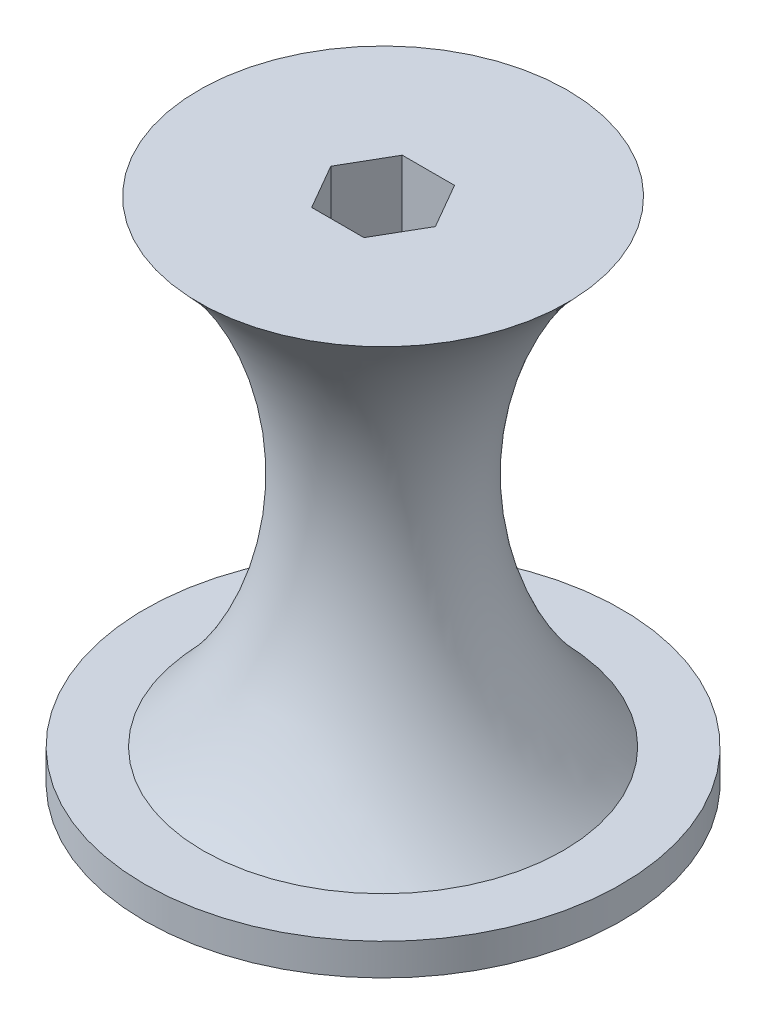
ISO-10303-21;
HEADER;
FILE_DESCRIPTION(('STEP AP214'),'2;1');
FILE_NAME('part.step','',(''),(''),'','','');
FILE_SCHEMA(('AUTOMOTIVE_DESIGN { 1 0 10303 214 1 1 1 1 }'));
ENDSEC;
DATA;
#1=APPLICATION_CONTEXT('core data for automotive mechanical design processes');
#2=APPLICATION_PROTOCOL_DEFINITION('international standard','automotive_design',2000,#1);
#3=PRODUCT_CONTEXT('',#1,'mechanical');
#4=PRODUCT('Part','Part','',(#3));
#5=PRODUCT_RELATED_PRODUCT_CATEGORY('part','',(#4));
#6=PRODUCT_DEFINITION_FORMATION('','',#4);
#7=PRODUCT_DEFINITION_CONTEXT('part definition',#1,'design');
#8=PRODUCT_DEFINITION('design','',#6,#7);
#9=PRODUCT_DEFINITION_SHAPE('','',#8);
#10=(LENGTH_UNIT() NAMED_UNIT(*) SI_UNIT(.MILLI.,.METRE.));
#11=(NAMED_UNIT(*) PLANE_ANGLE_UNIT() SI_UNIT($,.RADIAN.));
#12=(NAMED_UNIT(*) SI_UNIT($,.STERADIAN.) SOLID_ANGLE_UNIT());
#13=UNCERTAINTY_MEASURE_WITH_UNIT(LENGTH_MEASURE(1.E-05),#10,'distance_accuracy_value','');
#14=(GEOMETRIC_REPRESENTATION_CONTEXT(3) GLOBAL_UNCERTAINTY_ASSIGNED_CONTEXT((#13)) GLOBAL_UNIT_ASSIGNED_CONTEXT((#10,
#11,#12)) REPRESENTATION_CONTEXT('',''));
#15=CARTESIAN_POINT('',(0.,0.,0.));
#16=DIRECTION('',(0.,0.,1.));
#17=DIRECTION('',(1.,0.,0.));
#18=AXIS2_PLACEMENT_3D('',#15,#16,#17);
#19=CARTESIAN_POINT('',(0.,-5.08,0.));
#20=DIRECTION('',(0.,1.,0.));
#21=DIRECTION('',(0.,0.,1.));
#22=AXIS2_PLACEMENT_3D('',#19,#20,#21);
#23=CYLINDRICAL_SURFACE('',#22,38.1);
#24=CARTESIAN_POINT('',(0.,-5.08,0.));
#25=DIRECTION('',(0.,1.,0.));
#26=DIRECTION('',(0.,0.,1.));
#27=AXIS2_PLACEMENT_3D('',#24,#25,#26);
#28=CIRCLE('',#27,38.1);
#29=CARTESIAN_POINT('',(0.,-5.08,38.1));
#30=VERTEX_POINT('',#29);
#31=EDGE_CURVE('E42',#30,#30,#28,.T.);
#32=ORIENTED_EDGE('',*,*,#31,.T.);
#33=EDGE_LOOP('',(#32));
#34=FACE_BOUND('',#33,.T.);
#35=CARTESIAN_POINT('',(0.,0.,0.));
#36=DIRECTION('',(0.,1.,0.));
#37=DIRECTION('',(0.,0.,1.));
#38=AXIS2_PLACEMENT_3D('',#35,#36,#37);
#39=CIRCLE('',#38,38.1);
#40=CARTESIAN_POINT('',(0.,0.,38.1));
#41=VERTEX_POINT('',#40);
#42=EDGE_CURVE('E142',#41,#41,#39,.T.);
#43=ORIENTED_EDGE('',*,*,#42,.F.);
#44=EDGE_LOOP('',(#43));
#45=FACE_BOUND('',#44,.T.);
#46=ADVANCED_FACE('F35',(#34,#45),#23,.T.);
#47=CARTESIAN_POINT('',(0.,-5.08,0.));
#48=DIRECTION('',(0.,1.,0.));
#49=DIRECTION('',(0.,0.,1.));
#50=AXIS2_PLACEMENT_3D('',#47,#48,#49);
#51=PLANE('',#50);
#52=DIRECTION('',(0.5,0.,-0.866025403784439));
#53=VECTOR('',#52,1.);
#54=CARTESIAN_POINT('',(-8.3588771973274,-5.08,0.));
#55=LINE('',#54,#53);
#56=CARTESIAN_POINT('',(-8.3588771973274,-5.08,0.));
#57=VERTEX_POINT('',#56);
#58=CARTESIAN_POINT('',(-4.1794385986637,-5.08,-7.239));
#59=VERTEX_POINT('',#58);
#60=EDGE_CURVE('E120',#57,#59,#55,.T.);
#61=ORIENTED_EDGE('',*,*,#60,.F.);
#62=DIRECTION('',(-0.5,0.,-0.866025403784439));
#63=VECTOR('',#62,1.);
#64=CARTESIAN_POINT('',(-4.1794385986637,-5.08,7.239));
#65=LINE('',#64,#63);
#66=CARTESIAN_POINT('',(-4.1794385986637,-5.08,7.239));
#67=VERTEX_POINT('',#66);
#68=EDGE_CURVE('E49',#67,#57,#65,.T.);
#69=ORIENTED_EDGE('',*,*,#68,.F.);
#70=DIRECTION('',(-1.,0.,0.));
#71=VECTOR('',#70,1.);
#72=CARTESIAN_POINT('',(4.1794385986637,-5.08,7.239));
#73=LINE('',#72,#71);
#74=CARTESIAN_POINT('',(4.1794385986637,-5.08,7.239));
#75=VERTEX_POINT('',#74);
#76=EDGE_CURVE('E106',#75,#67,#73,.T.);
#77=ORIENTED_EDGE('',*,*,#76,.F.);
#78=DIRECTION('',(-0.5,0.,0.866025403784439));
#79=VECTOR('',#78,1.);
#80=CARTESIAN_POINT('',(8.3588771973274,-5.08,0.));
#81=LINE('',#80,#79);
#82=CARTESIAN_POINT('',(8.3588771973274,-5.08,0.));
#83=VERTEX_POINT('',#82);
#84=EDGE_CURVE('E109',#83,#75,#81,.T.);
#85=ORIENTED_EDGE('',*,*,#84,.F.);
#86=DIRECTION('',(0.5,0.,0.866025403784439));
#87=VECTOR('',#86,1.);
#88=CARTESIAN_POINT('',(4.1794385986637,-5.08,-7.239));
#89=LINE('',#88,#87);
#90=CARTESIAN_POINT('',(4.1794385986637,-5.08,-7.239));
#91=VERTEX_POINT('',#90);
#92=EDGE_CURVE('E125',#91,#83,#89,.T.);
#93=ORIENTED_EDGE('',*,*,#92,.F.);
#94=DIRECTION('',(1.,0.,0.));
#95=VECTOR('',#94,1.);
#96=CARTESIAN_POINT('',(-4.1794385986637,-5.08,-7.239));
#97=LINE('',#96,#95);
#98=EDGE_CURVE('E122',#59,#91,#97,.T.);
#99=ORIENTED_EDGE('',*,*,#98,.F.);
#100=EDGE_LOOP('',(#61,#69,#77,#85,#93,#99));
#101=FACE_BOUND('',#100,.T.);
#102=ORIENTED_EDGE('',*,*,#31,.F.);
#103=EDGE_LOOP('',(#102));
#104=FACE_BOUND('',#103,.T.);
#105=ADVANCED_FACE('F150',(#101,#104),#51,.F.);
#106=CARTESIAN_POINT('',(0.,0.,0.));
#107=DIRECTION('',(0.,1.,0.));
#108=DIRECTION('',(0.,0.,1.));
#109=AXIS2_PLACEMENT_3D('',#106,#107,#108);
#110=PLANE('',#109);
#111=CARTESIAN_POINT('',(0.,0.,0.));
#112=DIRECTION('',(0.,-1.,0.));
#113=DIRECTION('',(0.,0.,-1.));
#114=AXIS2_PLACEMENT_3D('',#111,#112,#113);
#115=CIRCLE('',#114,28.7869387648851);
#116=CARTESIAN_POINT('',(0.,0.,-28.7869387648851));
#117=VERTEX_POINT('',#116);
#118=EDGE_CURVE('E11',#117,#117,#115,.F.);
#119=ORIENTED_EDGE('',*,*,#118,.F.);
#120=EDGE_LOOP('',(#119));
#121=FACE_BOUND('',#120,.T.);
#122=ORIENTED_EDGE('',*,*,#42,.T.);
#123=EDGE_LOOP('',(#122));
#124=FACE_BOUND('',#123,.T.);
#125=ADVANCED_FACE('F147',(#121,#124),#110,.T.);
#126=CARTESIAN_POINT('',(0.,37.769068651599,0.));
#127=DIRECTION('',(0.,-1.,0.));
#128=DIRECTION('',(0.,0.,-1.));
#129=AXIS2_PLACEMENT_3D('',#126,#127,#128);
#130=TOROIDAL_SURFACE('',#129,66.9203659487891,53.6717878927031);
#131=CARTESIAN_POINT('',(0.,76.1958357903083,0.));
#132=DIRECTION('',(0.,-1.,0.));
#133=DIRECTION('',(0.,0.,-1.));
#134=AXIS2_PLACEMENT_3D('',#131,#132,#133);
#135=CIRCLE('',#134,29.4497857175367);
#136=CARTESIAN_POINT('',(0.,76.1958357903083,-29.4497857175367));
#137=VERTEX_POINT('',#136);
#138=EDGE_CURVE('E132',#137,#137,#135,.T.);
#139=ORIENTED_EDGE('',*,*,#138,.T.);
#140=EDGE_LOOP('',(#139));
#141=FACE_BOUND('',#140,.T.);
#142=ORIENTED_EDGE('',*,*,#118,.T.);
#143=EDGE_LOOP('',(#142));
#144=FACE_BOUND('',#143,.T.);
#145=ADVANCED_FACE('F162',(#141,#144),#130,.F.);
#146=CARTESIAN_POINT('',(0.,76.1958357903083,0.));
#147=DIRECTION('',(0.,1.,0.));
#148=DIRECTION('',(0.,0.,1.));
#149=AXIS2_PLACEMENT_3D('',#146,#147,#148);
#150=PLANE('',#149);
#151=DIRECTION('',(-0.5,0.,-0.866025403784439));
#152=VECTOR('',#151,1.);
#153=CARTESIAN_POINT('',(-4.1794385986637,76.1958357903083,7.239));
#154=LINE('',#153,#152);
#155=CARTESIAN_POINT('',(-4.1794385986637,76.1958357903083,7.239));
#156=VERTEX_POINT('',#155);
#157=CARTESIAN_POINT('',(-8.3588771973274,76.1958357903083,0.));
#158=VERTEX_POINT('',#157);
#159=EDGE_CURVE('E89',#156,#158,#154,.T.);
#160=ORIENTED_EDGE('',*,*,#159,.T.);
#161=DIRECTION('',(0.5,0.,-0.866025403784439));
#162=VECTOR('',#161,1.);
#163=CARTESIAN_POINT('',(-8.3588771973274,76.1958357903083,0.));
#164=LINE('',#163,#162);
#165=CARTESIAN_POINT('',(-4.1794385986637,76.1958357903083,-7.239));
#166=VERTEX_POINT('',#165);
#167=EDGE_CURVE('E98',#158,#166,#164,.T.);
#168=ORIENTED_EDGE('',*,*,#167,.T.);
#169=DIRECTION('',(1.,0.,0.));
#170=VECTOR('',#169,1.);
#171=CARTESIAN_POINT('',(-4.1794385986637,76.1958357903083,-7.239));
#172=LINE('',#171,#170);
#173=CARTESIAN_POINT('',(4.1794385986637,76.1958357903083,-7.239));
#174=VERTEX_POINT('',#173);
#175=EDGE_CURVE('E57',#166,#174,#172,.T.);
#176=ORIENTED_EDGE('',*,*,#175,.T.);
#177=DIRECTION('',(0.5,0.,0.866025403784439));
#178=VECTOR('',#177,1.);
#179=CARTESIAN_POINT('',(4.1794385986637,76.1958357903083,-7.239));
#180=LINE('',#179,#178);
#181=CARTESIAN_POINT('',(8.3588771973274,76.1958357903083,0.));
#182=VERTEX_POINT('',#181);
#183=EDGE_CURVE('E113',#174,#182,#180,.T.);
#184=ORIENTED_EDGE('',*,*,#183,.T.);
#185=DIRECTION('',(-0.5,0.,0.866025403784439));
#186=VECTOR('',#185,1.);
#187=CARTESIAN_POINT('',(8.3588771973274,76.1958357903083,0.));
#188=LINE('',#187,#186);
#189=CARTESIAN_POINT('',(4.1794385986637,76.1958357903083,7.239));
#190=VERTEX_POINT('',#189);
#191=EDGE_CURVE('E116',#182,#190,#188,.T.);
#192=ORIENTED_EDGE('',*,*,#191,.T.);
#193=DIRECTION('',(-1.,0.,0.));
#194=VECTOR('',#193,1.);
#195=CARTESIAN_POINT('',(4.1794385986637,76.1958357903083,7.239));
#196=LINE('',#195,#194);
#197=EDGE_CURVE('E95',#190,#156,#196,.T.);
#198=ORIENTED_EDGE('',*,*,#197,.T.);
#199=EDGE_LOOP('',(#160,#168,#176,#184,#192,#198));
#200=FACE_BOUND('',#199,.T.);
#201=ORIENTED_EDGE('',*,*,#138,.F.);
#202=EDGE_LOOP('',(#201));
#203=FACE_BOUND('',#202,.T.);
#204=ADVANCED_FACE('F102',(#200,#203),#150,.T.);
#205=CARTESIAN_POINT('',(-4.1794385986637,76.1958357903083,7.239));
#206=DIRECTION('',(-0.866025403784439,0.,0.5));
#207=DIRECTION('',(0.5,0.,0.866025403784439));
#208=AXIS2_PLACEMENT_3D('',#205,#206,#207);
#209=PLANE('',#208);
#210=ORIENTED_EDGE('',*,*,#68,.T.);
#211=DIRECTION('',(0.,-1.,0.));
#212=VECTOR('',#211,1.);
#213=CARTESIAN_POINT('',(-8.3588771973274,76.1958357903083,0.));
#214=LINE('',#213,#212);
#215=EDGE_CURVE('E85',#158,#57,#214,.T.);
#216=ORIENTED_EDGE('',*,*,#215,.F.);
#217=ORIENTED_EDGE('',*,*,#159,.F.);
#218=DIRECTION('',(0.,-1.,0.));
#219=VECTOR('',#218,1.);
#220=CARTESIAN_POINT('',(-4.1794385986637,76.1958357903083,7.239));
#221=LINE('',#220,#219);
#222=EDGE_CURVE('E130',#156,#67,#221,.T.);
#223=ORIENTED_EDGE('',*,*,#222,.T.);
#224=EDGE_LOOP('',(#210,#216,#217,#223));
#225=FACE_BOUND('',#224,.T.);
#226=ADVANCED_FACE('F87',(#225),#209,.F.);
#227=CARTESIAN_POINT('',(4.1794385986637,76.1958357903083,7.239));
#228=DIRECTION('',(0.,0.,1.));
#229=DIRECTION('',(1.,0.,0.));
#230=AXIS2_PLACEMENT_3D('',#227,#228,#229);
#231=PLANE('',#230);
#232=ORIENTED_EDGE('',*,*,#76,.T.);
#233=ORIENTED_EDGE('',*,*,#222,.F.);
#234=ORIENTED_EDGE('',*,*,#197,.F.);
#235=DIRECTION('',(0.,-1.,0.));
#236=VECTOR('',#235,1.);
#237=CARTESIAN_POINT('',(4.1794385986637,76.1958357903083,7.239));
#238=LINE('',#237,#236);
#239=EDGE_CURVE('E133',#190,#75,#238,.T.);
#240=ORIENTED_EDGE('',*,*,#239,.T.);
#241=EDGE_LOOP('',(#232,#233,#234,#240));
#242=FACE_BOUND('',#241,.T.);
#243=ADVANCED_FACE('F172',(#242),#231,.F.);
#244=CARTESIAN_POINT('',(8.3588771973274,76.1958357903083,0.));
#245=DIRECTION('',(0.866025403784439,0.,0.5));
#246=DIRECTION('',(0.5,0.,-0.866025403784439));
#247=AXIS2_PLACEMENT_3D('',#244,#245,#246);
#248=PLANE('',#247);
#249=ORIENTED_EDGE('',*,*,#84,.T.);
#250=ORIENTED_EDGE('',*,*,#239,.F.);
#251=ORIENTED_EDGE('',*,*,#191,.F.);
#252=DIRECTION('',(0.,-1.,0.));
#253=VECTOR('',#252,1.);
#254=CARTESIAN_POINT('',(8.3588771973274,76.1958357903083,0.));
#255=LINE('',#254,#253);
#256=EDGE_CURVE('E135',#182,#83,#255,.T.);
#257=ORIENTED_EDGE('',*,*,#256,.T.);
#258=EDGE_LOOP('',(#249,#250,#251,#257));
#259=FACE_BOUND('',#258,.T.);
#260=ADVANCED_FACE('F181',(#259),#248,.F.);
#261=CARTESIAN_POINT('',(4.1794385986637,76.1958357903083,-7.239));
#262=DIRECTION('',(0.866025403784439,0.,-0.5));
#263=DIRECTION('',(-0.5,0.,-0.866025403784439));
#264=AXIS2_PLACEMENT_3D('',#261,#262,#263);
#265=PLANE('',#264);
#266=ORIENTED_EDGE('',*,*,#92,.T.);
#267=ORIENTED_EDGE('',*,*,#256,.F.);
#268=ORIENTED_EDGE('',*,*,#183,.F.);
#269=DIRECTION('',(0.,-1.,0.));
#270=VECTOR('',#269,1.);
#271=CARTESIAN_POINT('',(4.1794385986637,76.1958357903083,-7.239));
#272=LINE('',#271,#270);
#273=EDGE_CURVE('E137',#174,#91,#272,.T.);
#274=ORIENTED_EDGE('',*,*,#273,.T.);
#275=EDGE_LOOP('',(#266,#267,#268,#274));
#276=FACE_BOUND('',#275,.T.);
#277=ADVANCED_FACE('F178',(#276),#265,.F.);
#278=CARTESIAN_POINT('',(-4.1794385986637,76.1958357903083,-7.239));
#279=DIRECTION('',(0.,0.,-1.));
#280=DIRECTION('',(-1.,0.,0.));
#281=AXIS2_PLACEMENT_3D('',#278,#279,#280);
#282=PLANE('',#281);
#283=ORIENTED_EDGE('',*,*,#98,.T.);
#284=ORIENTED_EDGE('',*,*,#273,.F.);
#285=ORIENTED_EDGE('',*,*,#175,.F.);
#286=DIRECTION('',(0.,-1.,0.));
#287=VECTOR('',#286,1.);
#288=CARTESIAN_POINT('',(-4.1794385986637,76.1958357903083,-7.239));
#289=LINE('',#288,#287);
#290=EDGE_CURVE('E94',#166,#59,#289,.T.);
#291=ORIENTED_EDGE('',*,*,#290,.T.);
#292=EDGE_LOOP('',(#283,#284,#285,#291));
#293=FACE_BOUND('',#292,.T.);
#294=ADVANCED_FACE('F175',(#293),#282,.F.);
#295=CARTESIAN_POINT('',(-8.3588771973274,76.1958357903083,0.));
#296=DIRECTION('',(-0.866025403784439,0.,-0.5));
#297=DIRECTION('',(-0.5,0.,0.866025403784439));
#298=AXIS2_PLACEMENT_3D('',#295,#296,#297);
#299=PLANE('',#298);
#300=ORIENTED_EDGE('',*,*,#60,.T.);
#301=ORIENTED_EDGE('',*,*,#290,.F.);
#302=ORIENTED_EDGE('',*,*,#167,.F.);
#303=ORIENTED_EDGE('',*,*,#215,.T.);
#304=EDGE_LOOP('',(#300,#301,#302,#303));
#305=FACE_BOUND('',#304,.T.);
#306=ADVANCED_FACE('F99',(#305),#299,.F.);
#307=CLOSED_SHELL('',(#46,#105,#125,#145,#204,#226,#243,#260,#277,#294,#306));
#308=MANIFOLD_SOLID_BREP('B2',#307);
#309=ADVANCED_BREP_SHAPE_REPRESENTATION('',(#18,#308),#14);
#310=SHAPE_DEFINITION_REPRESENTATION(#9,#309);
ENDSEC;
END-ISO-10303-21;
